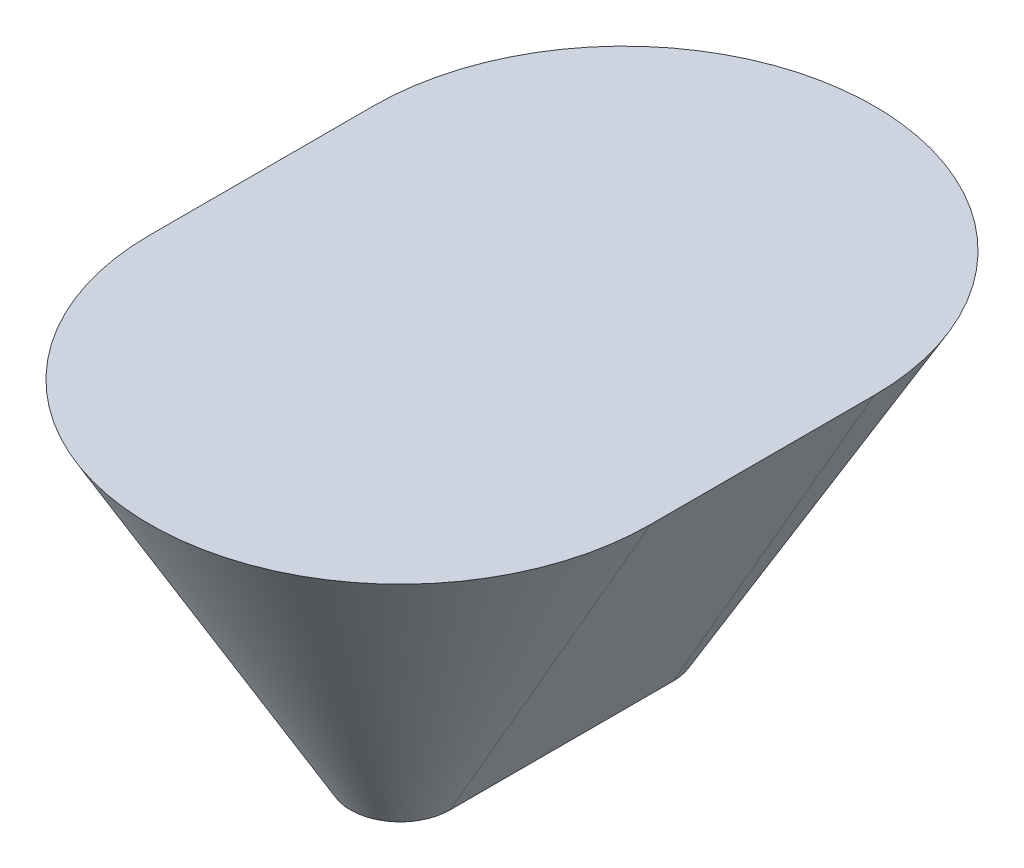
ISO-10303-21;
HEADER;
FILE_DESCRIPTION(('STEP AP214'),'2;1');
FILE_NAME('part.step','',(''),(''),'','','');
FILE_SCHEMA(('AUTOMOTIVE_DESIGN { 1 0 10303 214 1 1 1 1 }'));
ENDSEC;
DATA;
#1=APPLICATION_CONTEXT('core data for automotive mechanical design processes');
#2=APPLICATION_PROTOCOL_DEFINITION('international standard','automotive_design',2000,#1);
#3=PRODUCT_CONTEXT('',#1,'mechanical');
#4=PRODUCT('Part','Part','',(#3));
#5=PRODUCT_RELATED_PRODUCT_CATEGORY('part','',(#4));
#6=PRODUCT_DEFINITION_FORMATION('','',#4);
#7=PRODUCT_DEFINITION_CONTEXT('part definition',#1,'design');
#8=PRODUCT_DEFINITION('design','',#6,#7);
#9=PRODUCT_DEFINITION_SHAPE('','',#8);
#10=(LENGTH_UNIT() NAMED_UNIT(*) SI_UNIT(.MILLI.,.METRE.));
#11=(NAMED_UNIT(*) PLANE_ANGLE_UNIT() SI_UNIT($,.RADIAN.));
#12=(NAMED_UNIT(*) SI_UNIT($,.STERADIAN.) SOLID_ANGLE_UNIT());
#13=UNCERTAINTY_MEASURE_WITH_UNIT(LENGTH_MEASURE(1.E-05),#10,'distance_accuracy_value','');
#14=(GEOMETRIC_REPRESENTATION_CONTEXT(3) GLOBAL_UNCERTAINTY_ASSIGNED_CONTEXT((#13)) GLOBAL_UNIT_ASSIGNED_CONTEXT((#10,
#11,#12)) REPRESENTATION_CONTEXT('',''));
#15=CARTESIAN_POINT('',(0.,0.,0.));
#16=DIRECTION('',(0.,0.,1.));
#17=DIRECTION('',(1.,0.,0.));
#18=AXIS2_PLACEMENT_3D('',#15,#16,#17);
#19=CARTESIAN_POINT('',(0.,0.,22.5));
#20=DIRECTION('',(0.,1.,0.));
#21=DIRECTION('',(0.,0.,1.));
#22=AXIS2_PLACEMENT_3D('',#19,#20,#21);
#23=CONICAL_SURFACE('',#22,10.,0.5235987755983);
#24=CARTESIAN_POINT('',(0.,0.,22.5));
#25=DIRECTION('',(0.,1.,0.));
#26=DIRECTION('',(0.,0.,1.));
#27=AXIS2_PLACEMENT_3D('',#24,#25,#26);
#28=CIRCLE('',#27,10.);
#29=CARTESIAN_POINT('',(-10.,0.,22.5));
#30=VERTEX_POINT('',#29);
#31=CARTESIAN_POINT('',(10.,0.,22.5));
#32=VERTEX_POINT('',#31);
#33=EDGE_CURVE('E88',#30,#32,#28,.T.);
#34=ORIENTED_EDGE('',*,*,#33,.T.);
#35=DIRECTION('',(0.500000000000001,0.866025403784438,0.));
#36=VECTOR('',#35,1.);
#37=CARTESIAN_POINT('',(10.,0.,22.5));
#38=LINE('',#37,#36);
#39=CARTESIAN_POINT('',(50.4145188432739,70.,22.5));
#40=VERTEX_POINT('',#39);
#41=EDGE_CURVE('E11',#40,#32,#38,.F.);
#42=ORIENTED_EDGE('',*,*,#41,.F.);
#43=CARTESIAN_POINT('',(0.,70.,22.5));
#44=DIRECTION('',(0.,1.,0.));
#45=DIRECTION('',(0.,0.,1.));
#46=AXIS2_PLACEMENT_3D('',#43,#44,#45);
#47=CIRCLE('',#46,50.4145188432739);
#48=CARTESIAN_POINT('',(-50.4145188432739,70.,22.5));
#49=VERTEX_POINT('',#48);
#50=EDGE_CURVE('E109',#49,#40,#47,.T.);
#51=ORIENTED_EDGE('',*,*,#50,.F.);
#52=DIRECTION('',(-0.500000000000001,0.866025403784438,0.));
#53=VECTOR('',#52,1.);
#54=CARTESIAN_POINT('',(-10.,0.,22.5));
#55=LINE('',#54,#53);
#56=EDGE_CURVE('E100',#49,#30,#55,.F.);
#57=ORIENTED_EDGE('',*,*,#56,.T.);
#58=EDGE_LOOP('',(#34,#42,#51,#57));
#59=FACE_BOUND('',#58,.T.);
#60=ADVANCED_FACE('F41',(#59),#23,.T.);
#61=CARTESIAN_POINT('',(10.,0.,22.5));
#62=DIRECTION('',(0.866025403784438,-0.500000000000001,0.));
#63=DIRECTION('',(0.500000000000001,0.866025403784438,0.));
#64=AXIS2_PLACEMENT_3D('',#61,#62,#63);
#65=PLANE('',#64);
#66=DIRECTION('',(0.,0.,-1.));
#67=VECTOR('',#66,1.);
#68=CARTESIAN_POINT('',(10.,0.,22.5));
#69=LINE('',#68,#67);
#70=CARTESIAN_POINT('',(10.,0.,-22.5));
#71=VERTEX_POINT('',#70);
#72=EDGE_CURVE('E84',#32,#71,#69,.T.);
#73=ORIENTED_EDGE('',*,*,#72,.T.);
#74=DIRECTION('',(0.500000000000001,0.866025403784438,0.));
#75=VECTOR('',#74,1.);
#76=CARTESIAN_POINT('',(10.,0.,-22.5));
#77=LINE('',#76,#75);
#78=CARTESIAN_POINT('',(50.4145188432739,70.,-22.5));
#79=VERTEX_POINT('',#78);
#80=EDGE_CURVE('E45',#79,#71,#77,.F.);
#81=ORIENTED_EDGE('',*,*,#80,.F.);
#82=DIRECTION('',(0.,0.,1.));
#83=VECTOR('',#82,1.);
#84=CARTESIAN_POINT('',(50.4145188432739,70.,22.5));
#85=LINE('',#84,#83);
#86=EDGE_CURVE('E96',#40,#79,#85,.F.);
#87=ORIENTED_EDGE('',*,*,#86,.F.);
#88=ORIENTED_EDGE('',*,*,#41,.T.);
#89=EDGE_LOOP('',(#73,#81,#87,#88));
#90=FACE_BOUND('',#89,.T.);
#91=ADVANCED_FACE('F43',(#90),#65,.T.);
#92=CARTESIAN_POINT('',(0.,0.,-22.5));
#93=DIRECTION('',(0.,1.,0.));
#94=DIRECTION('',(0.,0.,1.));
#95=AXIS2_PLACEMENT_3D('',#92,#93,#94);
#96=CONICAL_SURFACE('',#95,10.,0.5235987755983);
#97=CARTESIAN_POINT('',(0.,0.,-22.5));
#98=DIRECTION('',(0.,1.,0.));
#99=DIRECTION('',(0.,0.,1.));
#100=AXIS2_PLACEMENT_3D('',#97,#98,#99);
#101=CIRCLE('',#100,10.);
#102=CARTESIAN_POINT('',(-10.,0.,-22.5));
#103=VERTEX_POINT('',#102);
#104=EDGE_CURVE('E89',#71,#103,#101,.T.);
#105=ORIENTED_EDGE('',*,*,#104,.T.);
#106=DIRECTION('',(-0.500000000000001,0.866025403784438,0.));
#107=VECTOR('',#106,1.);
#108=CARTESIAN_POINT('',(-10.,0.,-22.5));
#109=LINE('',#108,#107);
#110=CARTESIAN_POINT('',(-50.4145188432739,70.,-22.5));
#111=VERTEX_POINT('',#110);
#112=EDGE_CURVE('E119',#111,#103,#109,.F.);
#113=ORIENTED_EDGE('',*,*,#112,.F.);
#114=CARTESIAN_POINT('',(0.,70.,-22.5));
#115=DIRECTION('',(0.,1.,0.));
#116=DIRECTION('',(0.,0.,1.));
#117=AXIS2_PLACEMENT_3D('',#114,#115,#116);
#118=CIRCLE('',#117,50.4145188432739);
#119=EDGE_CURVE('E63',#79,#111,#118,.T.);
#120=ORIENTED_EDGE('',*,*,#119,.F.);
#121=ORIENTED_EDGE('',*,*,#80,.T.);
#122=EDGE_LOOP('',(#105,#113,#120,#121));
#123=FACE_BOUND('',#122,.T.);
#124=ADVANCED_FACE('F125',(#123),#96,.T.);
#125=CARTESIAN_POINT('',(-10.,0.,22.5));
#126=DIRECTION('',(-0.866025403784438,-0.500000000000001,0.));
#127=DIRECTION('',(0.500000000000001,-0.866025403784438,0.));
#128=AXIS2_PLACEMENT_3D('',#125,#126,#127);
#129=PLANE('',#128);
#130=DIRECTION('',(0.,0.,1.));
#131=VECTOR('',#130,1.);
#132=CARTESIAN_POINT('',(-10.,0.,22.5));
#133=LINE('',#132,#131);
#134=EDGE_CURVE('E106',#103,#30,#133,.T.);
#135=ORIENTED_EDGE('',*,*,#134,.T.);
#136=ORIENTED_EDGE('',*,*,#56,.F.);
#137=DIRECTION('',(0.,0.,-1.));
#138=VECTOR('',#137,1.);
#139=CARTESIAN_POINT('',(-50.4145188432739,70.,22.5));
#140=LINE('',#139,#138);
#141=EDGE_CURVE('E58',#111,#49,#140,.F.);
#142=ORIENTED_EDGE('',*,*,#141,.F.);
#143=ORIENTED_EDGE('',*,*,#112,.T.);
#144=EDGE_LOOP('',(#135,#136,#142,#143));
#145=FACE_BOUND('',#144,.T.);
#146=ADVANCED_FACE('F126',(#145),#129,.T.);
#147=CARTESIAN_POINT('',(0.,70.,22.5));
#148=DIRECTION('',(0.,1.,0.));
#149=DIRECTION('',(0.,0.,1.));
#150=AXIS2_PLACEMENT_3D('',#147,#148,#149);
#151=PLANE('',#150);
#152=ORIENTED_EDGE('',*,*,#50,.T.);
#153=ORIENTED_EDGE('',*,*,#86,.T.);
#154=ORIENTED_EDGE('',*,*,#119,.T.);
#155=ORIENTED_EDGE('',*,*,#141,.T.);
#156=EDGE_LOOP('',(#152,#153,#154,#155));
#157=FACE_BOUND('',#156,.T.);
#158=ADVANCED_FACE('F127',(#157),#151,.T.);
#159=CARTESIAN_POINT('',(0.,0.,22.5));
#160=DIRECTION('',(0.,1.,0.));
#161=DIRECTION('',(0.,0.,1.));
#162=AXIS2_PLACEMENT_3D('',#159,#160,#161);
#163=PLANE('',#162);
#164=ORIENTED_EDGE('',*,*,#33,.F.);
#165=ORIENTED_EDGE('',*,*,#134,.F.);
#166=ORIENTED_EDGE('',*,*,#104,.F.);
#167=ORIENTED_EDGE('',*,*,#72,.F.);
#168=EDGE_LOOP('',(#164,#165,#166,#167));
#169=FACE_BOUND('',#168,.T.);
#170=ADVANCED_FACE('F85',(#169),#163,.F.);
#171=CLOSED_SHELL('',(#60,#91,#124,#146,#158,#170));
#172=MANIFOLD_SOLID_BREP('B2',#171);
#173=ADVANCED_BREP_SHAPE_REPRESENTATION('',(#18,#172),#14);
#174=SHAPE_DEFINITION_REPRESENTATION(#9,#173);
ENDSEC;
END-ISO-10303-21;
